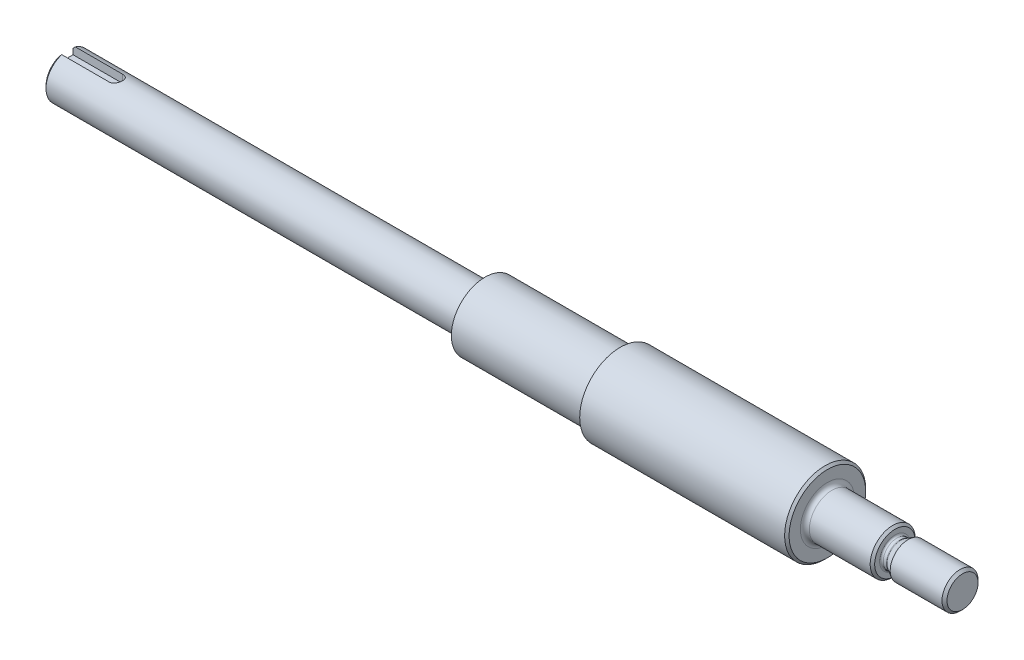
ISO-10303-21;
HEADER;
FILE_DESCRIPTION(('STEP AP214'),'2;1');
FILE_NAME('part.step','',(''),(''),'','','');
FILE_SCHEMA(('AUTOMOTIVE_DESIGN { 1 0 10303 214 1 1 1 1 }'));
ENDSEC;
DATA;
#1=APPLICATION_CONTEXT('core data for automotive mechanical design processes');
#2=APPLICATION_PROTOCOL_DEFINITION('international standard','automotive_design',2000,#1);
#3=PRODUCT_CONTEXT('',#1,'mechanical');
#4=PRODUCT('Part','Part','',(#3));
#5=PRODUCT_RELATED_PRODUCT_CATEGORY('part','',(#4));
#6=PRODUCT_DEFINITION_FORMATION('','',#4);
#7=PRODUCT_DEFINITION_CONTEXT('part definition',#1,'design');
#8=PRODUCT_DEFINITION('design','',#6,#7);
#9=PRODUCT_DEFINITION_SHAPE('','',#8);
#10=(LENGTH_UNIT() NAMED_UNIT(*) SI_UNIT(.MILLI.,.METRE.));
#11=(NAMED_UNIT(*) PLANE_ANGLE_UNIT() SI_UNIT($,.RADIAN.));
#12=(NAMED_UNIT(*) SI_UNIT($,.STERADIAN.) SOLID_ANGLE_UNIT());
#13=UNCERTAINTY_MEASURE_WITH_UNIT(LENGTH_MEASURE(1.E-05),#10,'distance_accuracy_value','');
#14=(GEOMETRIC_REPRESENTATION_CONTEXT(3) GLOBAL_UNCERTAINTY_ASSIGNED_CONTEXT((#13)) GLOBAL_UNIT_ASSIGNED_CONTEXT((#10,
#11,#12)) REPRESENTATION_CONTEXT('',''));
#15=CARTESIAN_POINT('',(0.,0.,0.));
#16=DIRECTION('',(0.,0.,1.));
#17=DIRECTION('',(1.,0.,0.));
#18=AXIS2_PLACEMENT_3D('',#15,#16,#17);
#19=CARTESIAN_POINT('',(0.,0.,0.));
#20=DIRECTION('',(-1.,0.,0.));
#21=DIRECTION('',(0.,0.,1.));
#22=AXIS2_PLACEMENT_3D('',#19,#20,#21);
#23=PLANE('',#22);
#24=DIRECTION('',(0.,1.,0.));
#25=VECTOR('',#24,1.);
#26=CARTESIAN_POINT('',(0.,0.,-1.5));
#27=LINE('',#26,#25);
#28=CARTESIAN_POINT('',(0.,3.,-1.5));
#29=VERTEX_POINT('',#28);
#30=CARTESIAN_POINT('',(0.,4.24264068711932,-1.5));
#31=VERTEX_POINT('',#30);
#32=EDGE_CURVE('E108',#29,#31,#27,.T.);
#33=ORIENTED_EDGE('',*,*,#32,.T.);
#34=CARTESIAN_POINT('',(0.,0.,0.));
#35=DIRECTION('',(-1.,0.,0.));
#36=DIRECTION('',(0.,0.,1.));
#37=AXIS2_PLACEMENT_3D('',#34,#35,#36);
#38=CIRCLE('',#37,4.50000000000003);
#39=CARTESIAN_POINT('',(0.,4.24264068711932,1.5));
#40=VERTEX_POINT('',#39);
#41=EDGE_CURVE('E270',#31,#40,#38,.T.);
#42=ORIENTED_EDGE('',*,*,#41,.T.);
#43=DIRECTION('',(0.,-1.,0.));
#44=VECTOR('',#43,1.);
#45=CARTESIAN_POINT('',(0.,0.,1.5));
#46=LINE('',#45,#44);
#47=CARTESIAN_POINT('',(0.,3.,1.5));
#48=VERTEX_POINT('',#47);
#49=EDGE_CURVE('E101',#40,#48,#46,.T.);
#50=ORIENTED_EDGE('',*,*,#49,.T.);
#51=DIRECTION('',(0.,0.,-1.));
#52=VECTOR('',#51,1.);
#53=CARTESIAN_POINT('',(0.,3.,0.));
#54=LINE('',#53,#52);
#55=EDGE_CURVE('E255',#48,#29,#54,.T.);
#56=ORIENTED_EDGE('',*,*,#55,.T.);
#57=EDGE_LOOP('',(#33,#42,#50,#56));
#58=FACE_BOUND('',#57,.T.);
#59=ADVANCED_FACE('F43',(#58),#23,.T.);
#60=CARTESIAN_POINT('',(0.,0.,0.));
#61=DIRECTION('',(-1.,0.,0.));
#62=DIRECTION('',(0.,0.,1.));
#63=AXIS2_PLACEMENT_3D('',#60,#61,#62);
#64=CYLINDRICAL_SURFACE('',#63,5.);
#65=CARTESIAN_POINT('',(92.,0.,0.));
#66=DIRECTION('',(-1.,0.,0.));
#67=DIRECTION('',(0.,0.,1.));
#68=AXIS2_PLACEMENT_3D('',#65,#66,#67);
#69=CIRCLE('',#68,5.);
#70=CARTESIAN_POINT('',(92.,0.,5.));
#71=VERTEX_POINT('',#70);
#72=EDGE_CURVE('E258',#71,#71,#69,.T.);
#73=ORIENTED_EDGE('',*,*,#72,.T.);
#74=EDGE_LOOP('',(#73));
#75=FACE_BOUND('',#74,.T.);
#76=DIRECTION('',(-1.,0.,0.));
#77=VECTOR('',#76,1.);
#78=CARTESIAN_POINT('',(0.,4.76969600708473,1.5));
#79=LINE('',#78,#77);
#80=CARTESIAN_POINT('',(11.,4.76969600708473,1.5));
#81=VERTEX_POINT('',#80);
#82=CARTESIAN_POINT('',(0.499999999999987,4.76969600708473,1.5));
#83=VERTEX_POINT('',#82);
#84=EDGE_CURVE('E134',#81,#83,#79,.T.);
#85=ORIENTED_EDGE('',*,*,#84,.T.);
#86=CARTESIAN_POINT('',(0.499999999999987,0.,0.));
#87=DIRECTION('',(-1.,0.,0.));
#88=DIRECTION('',(0.,0.,1.));
#89=AXIS2_PLACEMENT_3D('',#86,#87,#88);
#90=CIRCLE('',#89,5.);
#91=CARTESIAN_POINT('',(0.499999999999987,4.76969600708473,-1.5));
#92=VERTEX_POINT('',#91);
#93=EDGE_CURVE('E59',#83,#92,#90,.F.);
#94=ORIENTED_EDGE('',*,*,#93,.T.);
#95=DIRECTION('',(-1.,0.,0.));
#96=VECTOR('',#95,1.);
#97=CARTESIAN_POINT('',(0.,4.76969600708473,-1.5));
#98=LINE('',#97,#96);
#99=CARTESIAN_POINT('',(11.,4.76969600708473,-1.5));
#100=VERTEX_POINT('',#99);
#101=EDGE_CURVE('E143',#92,#100,#98,.F.);
#102=ORIENTED_EDGE('',*,*,#101,.T.);
#103=CARTESIAN_POINT('',(11.,4.76969600708473,-1.5));
#104=CARTESIAN_POINT('',(11.041179392908,4.76969249084934,-1.50000085357071));
#105=CARTESIAN_POINT('',(11.0823380431261,4.77022997000129,-1.49830317083428));
#106=CARTESIAN_POINT('',(11.1643411620956,4.77235095109999,-1.49153785660317));
#107=CARTESIAN_POINT('',(11.2051856993949,4.77393421787376,-1.48647098275841));
#108=CARTESIAN_POINT('',(11.3265905409547,4.78018490618873,-1.46630203689311));
#109=CARTESIAN_POINT('',(11.4063063904164,4.78635370384275,-1.44623120413662));
#110=CARTESIAN_POINT('',(11.5610355783859,4.80195952113208,-1.39353102315626));
#111=CARTESIAN_POINT('',(11.6360505521981,4.81139539670393,-1.36090607068203));
#112=CARTESIAN_POINT('',(11.7795966815976,4.83246571212052,-1.28407841117656));
#113=CARTESIAN_POINT('',(11.8481247997284,4.84410117434933,-1.23987031651226));
#114=CARTESIAN_POINT('',(11.978866055997,4.86866835244721,-1.13964850658326));
#115=CARTESIAN_POINT('',(12.0408436603434,4.88162755412974,-1.08333433465208));
#116=CARTESIAN_POINT('',(12.1546355839,4.90714811559049,-0.961138919873355));
#117=CARTESIAN_POINT('',(12.2064481860031,4.91970940785249,-0.895256063916349));
#118=CARTESIAN_POINT('',(12.2994637703185,4.94333239727705,-0.754109921315431));
#119=CARTESIAN_POINT('',(12.340425180298,4.95435770971354,-0.67868081933626));
#120=CARTESIAN_POINT('',(12.4089884116182,4.97334469846208,-0.521621185505775));
#121=CARTESIAN_POINT('',(12.4365936777943,4.98130716463903,-0.439992259012928));
#122=CARTESIAN_POINT('',(12.476879799102,4.99307639935002,-0.275324697874879));
#123=CARTESIAN_POINT('',(12.4899648579697,4.99699549276993,-0.192393125294255));
#124=CARTESIAN_POINT('',(12.5021173413633,5.00063202022426,-0.0254235719980832));
#125=CARTESIAN_POINT('',(12.5011874197002,5.00035024971471,0.0586141962423611));
#126=CARTESIAN_POINT('',(12.485607091241,4.99569602566267,0.222571599946016));
#127=CARTESIAN_POINT('',(12.4713946550213,4.99145415509187,0.30253714546464));
#128=CARTESIAN_POINT('',(12.4303683647619,4.9795151369998,0.458890052102024));
#129=CARTESIAN_POINT('',(12.4035538505441,4.97181780846028,0.535277225531996));
#130=CARTESIAN_POINT('',(12.3377877783536,4.95365214926145,0.683347815892215));
#131=CARTESIAN_POINT('',(12.2986983556431,4.94315255692525,0.754966006044141));
#132=CARTESIAN_POINT('',(12.2096014099517,4.92049624651755,0.890765529574419));
#133=CARTESIAN_POINT('',(12.1595914405212,4.90833915735884,0.954945191614594));
#134=CARTESIAN_POINT('',(12.0478080119165,4.88311673571409,1.07665450541275));
#135=CARTESIAN_POINT('',(11.9856561362393,4.87003445449554,1.13383351478034));
#136=CARTESIAN_POINT('',(11.8525025765721,4.84484215114658,1.23706769492487));
#137=CARTESIAN_POINT('',(11.7814983196345,4.83273241337565,1.28311962013078));
#138=CARTESIAN_POINT('',(11.6317190715507,4.81077228795653,1.36316407240863));
#139=CARTESIAN_POINT('',(11.5528728204066,4.80094596245948,1.39703006341135));
#140=CARTESIAN_POINT('',(11.3902754960183,4.78495663653201,1.45085886004699));
#141=CARTESIAN_POINT('',(11.3065321392856,4.77878803475875,1.47084293218035));
#142=CARTESIAN_POINT('',(11.1850051109298,4.77314032325006,1.4890120359008));
#143=CARTESIAN_POINT('',(11.1481092658204,4.77185156275267,1.49313202989009));
#144=CARTESIAN_POINT('',(11.0741485209005,4.77012928611782,1.49862355614854));
#145=CARTESIAN_POINT('',(11.0370839503361,4.76969451246644,1.49999912968269));
#146=CARTESIAN_POINT('',(11.,4.76969600708473,1.5));
#147=B_SPLINE_CURVE_WITH_KNOTS('',3,(#103,#104,#105,#106,#107,#108,#109,#110,#111,#112,#113,
#114,#115,#116,#117,#118,#119,#120,#121,#122,#123,#124,#125,#126,#127,#128,#129,#130,#131,#132,
#133,#134,#135,#136,#137,#138,#139,#140,#141,#142,#143,#144,#145,#146),.UNSPECIFIED.,.F.,.F.,(4,
2,2,2,2,2,2,2,2,2,2,2,2,2,2,2,2,2,2,2,2,4),(0.,0.123459071219734,0.246890388853042,
0.49291134961521,0.738846245884321,0.984895736828092,1.23795510798803,1.49105719006936,
1.74939356197455,2.00766326783256,2.25854751319802,2.5093842528947,2.75223130012966,
2.99509107067835,3.2407824256273,3.48652887757005,3.74172568310981,3.99699683536777,
4.25484698071527,4.51230123440207,4.62365084745809,4.73483637253615),.UNSPECIFIED.);
#148=EDGE_CURVE('E99',#100,#81,#147,.T.);
#149=ORIENTED_EDGE('',*,*,#148,.T.);
#150=EDGE_LOOP('',(#85,#94,#102,#149));
#151=FACE_BOUND('',#150,.T.);
#152=ADVANCED_FACE('F145',(#75,#151),#64,.T.);
#153=CARTESIAN_POINT('',(93.,0.,5.));
#154=DIRECTION('',(-1.,0.,0.));
#155=DIRECTION('',(0.,0.,1.));
#156=AXIS2_PLACEMENT_3D('',#153,#154,#155);
#157=PLANE('',#156);
#158=CARTESIAN_POINT('',(93.,0.,0.));
#159=DIRECTION('',(-1.,0.,0.));
#160=DIRECTION('',(0.,0.,1.));
#161=AXIS2_PLACEMENT_3D('',#158,#159,#160);
#162=CIRCLE('',#161,6.);
#163=CARTESIAN_POINT('',(93.,0.,6.));
#164=VERTEX_POINT('',#163);
#165=EDGE_CURVE('E263',#164,#164,#162,.F.);
#166=ORIENTED_EDGE('',*,*,#165,.T.);
#167=EDGE_LOOP('',(#166));
#168=FACE_BOUND('',#167,.T.);
#169=CARTESIAN_POINT('',(93.,0.,0.));
#170=DIRECTION('',(-1.,0.,0.));
#171=DIRECTION('',(0.,0.,1.));
#172=AXIS2_PLACEMENT_3D('',#169,#170,#171);
#173=CIRCLE('',#172,7.5);
#174=CARTESIAN_POINT('',(93.,0.,7.5));
#175=VERTEX_POINT('',#174);
#176=EDGE_CURVE('E131',#175,#175,#173,.T.);
#177=ORIENTED_EDGE('',*,*,#176,.T.);
#178=EDGE_LOOP('',(#177));
#179=FACE_BOUND('',#178,.T.);
#180=ADVANCED_FACE('F177',(#168,#179),#157,.T.);
#181=CARTESIAN_POINT('',(0.,0.,0.));
#182=DIRECTION('',(-1.,0.,0.));
#183=DIRECTION('',(0.,0.,1.));
#184=AXIS2_PLACEMENT_3D('',#181,#182,#183);
#185=CYLINDRICAL_SURFACE('',#184,7.5);
#186=CARTESIAN_POINT('',(122.,0.,0.));
#187=DIRECTION('',(-1.,0.,0.));
#188=DIRECTION('',(0.,0.,1.));
#189=AXIS2_PLACEMENT_3D('',#186,#187,#188);
#190=CIRCLE('',#189,7.5);
#191=CARTESIAN_POINT('',(122.,0.,7.5));
#192=VERTEX_POINT('',#191);
#193=EDGE_CURVE('E265',#192,#192,#190,.T.);
#194=ORIENTED_EDGE('',*,*,#193,.T.);
#195=EDGE_LOOP('',(#194));
#196=FACE_BOUND('',#195,.T.);
#197=ORIENTED_EDGE('',*,*,#176,.F.);
#198=EDGE_LOOP('',(#197));
#199=FACE_BOUND('',#198,.T.);
#200=ADVANCED_FACE('F174',(#196,#199),#185,.T.);
#201=CARTESIAN_POINT('',(123.,0.,7.5));
#202=DIRECTION('',(-1.,0.,0.));
#203=DIRECTION('',(0.,0.,1.));
#204=AXIS2_PLACEMENT_3D('',#201,#202,#203);
#205=PLANE('',#204);
#206=CARTESIAN_POINT('',(123.,0.,0.));
#207=DIRECTION('',(-1.,0.,0.));
#208=DIRECTION('',(0.,0.,1.));
#209=AXIS2_PLACEMENT_3D('',#206,#207,#208);
#210=CIRCLE('',#209,8.5);
#211=CARTESIAN_POINT('',(123.,0.,8.5));
#212=VERTEX_POINT('',#211);
#213=EDGE_CURVE('E268',#212,#212,#210,.F.);
#214=ORIENTED_EDGE('',*,*,#213,.T.);
#215=EDGE_LOOP('',(#214));
#216=FACE_BOUND('',#215,.T.);
#217=CARTESIAN_POINT('',(123.,0.,0.));
#218=DIRECTION('',(-1.,0.,0.));
#219=DIRECTION('',(0.,0.,1.));
#220=AXIS2_PLACEMENT_3D('',#217,#218,#219);
#221=CIRCLE('',#220,9.);
#222=CARTESIAN_POINT('',(123.,0.,9.));
#223=VERTEX_POINT('',#222);
#224=EDGE_CURVE('E128',#223,#223,#221,.T.);
#225=ORIENTED_EDGE('',*,*,#224,.T.);
#226=EDGE_LOOP('',(#225));
#227=FACE_BOUND('',#226,.T.);
#228=ADVANCED_FACE('F170',(#216,#227),#205,.T.);
#229=CARTESIAN_POINT('',(0.,0.,0.));
#230=DIRECTION('',(-1.,0.,0.));
#231=DIRECTION('',(0.,0.,1.));
#232=AXIS2_PLACEMENT_3D('',#229,#230,#231);
#233=CYLINDRICAL_SURFACE('',#232,9.);
#234=CARTESIAN_POINT('',(168.5,0.,0.));
#235=DIRECTION('',(1.,0.,0.));
#236=DIRECTION('',(0.,0.,-1.));
#237=AXIS2_PLACEMENT_3D('',#234,#235,#236);
#238=CIRCLE('',#237,9.);
#239=CARTESIAN_POINT('',(168.5,0.,-9.));
#240=VERTEX_POINT('',#239);
#241=EDGE_CURVE('E52',#240,#240,#238,.F.);
#242=ORIENTED_EDGE('',*,*,#241,.T.);
#243=EDGE_LOOP('',(#242));
#244=FACE_BOUND('',#243,.T.);
#245=ORIENTED_EDGE('',*,*,#224,.F.);
#246=EDGE_LOOP('',(#245));
#247=FACE_BOUND('',#246,.T.);
#248=ADVANCED_FACE('F166',(#244,#247),#233,.T.);
#249=CARTESIAN_POINT('',(169.,0.,9.));
#250=DIRECTION('',(1.,0.,0.));
#251=DIRECTION('',(0.,0.,-1.));
#252=AXIS2_PLACEMENT_3D('',#249,#250,#251);
#253=PLANE('',#252);
#254=CARTESIAN_POINT('',(169.,0.,0.));
#255=DIRECTION('',(1.,0.,0.));
#256=DIRECTION('',(0.,0.,-1.));
#257=AXIS2_PLACEMENT_3D('',#254,#255,#256);
#258=CIRCLE('',#257,8.49999999999994);
#259=CARTESIAN_POINT('',(169.,0.,-8.49999999999994));
#260=VERTEX_POINT('',#259);
#261=EDGE_CURVE('E11',#260,#260,#258,.T.);
#262=ORIENTED_EDGE('',*,*,#261,.T.);
#263=EDGE_LOOP('',(#262));
#264=FACE_BOUND('',#263,.T.);
#265=CARTESIAN_POINT('',(169.,0.,0.));
#266=DIRECTION('',(1.,0.,0.));
#267=DIRECTION('',(0.,0.,-1.));
#268=AXIS2_PLACEMENT_3D('',#265,#266,#267);
#269=CIRCLE('',#268,6.);
#270=CARTESIAN_POINT('',(169.,0.,-6.));
#271=VERTEX_POINT('',#270);
#272=EDGE_CURVE('E252',#271,#271,#269,.F.);
#273=ORIENTED_EDGE('',*,*,#272,.T.);
#274=EDGE_LOOP('',(#273));
#275=FACE_BOUND('',#274,.T.);
#276=ADVANCED_FACE('F162',(#264,#275),#253,.T.);
#277=CARTESIAN_POINT('',(0.,0.,0.));
#278=DIRECTION('',(-1.,0.,0.));
#279=DIRECTION('',(0.,0.,1.));
#280=AXIS2_PLACEMENT_3D('',#277,#278,#279);
#281=CYLINDRICAL_SURFACE('',#280,5.);
#282=CARTESIAN_POINT('',(183.5,0.,0.));
#283=DIRECTION('',(1.,0.,0.));
#284=DIRECTION('',(0.,0.,-1.));
#285=AXIS2_PLACEMENT_3D('',#282,#283,#284);
#286=CIRCLE('',#285,5.);
#287=CARTESIAN_POINT('',(183.5,0.,-5.));
#288=VERTEX_POINT('',#287);
#289=EDGE_CURVE('E228',#288,#288,#286,.F.);
#290=ORIENTED_EDGE('',*,*,#289,.T.);
#291=EDGE_LOOP('',(#290));
#292=FACE_BOUND('',#291,.T.);
#293=CARTESIAN_POINT('',(170.,0.,0.));
#294=DIRECTION('',(1.,0.,0.));
#295=DIRECTION('',(0.,0.,-1.));
#296=AXIS2_PLACEMENT_3D('',#293,#294,#295);
#297=CIRCLE('',#296,5.);
#298=CARTESIAN_POINT('',(170.,0.,-5.));
#299=VERTEX_POINT('',#298);
#300=EDGE_CURVE('E254',#299,#299,#297,.T.);
#301=ORIENTED_EDGE('',*,*,#300,.T.);
#302=EDGE_LOOP('',(#301));
#303=FACE_BOUND('',#302,.T.);
#304=ADVANCED_FACE('F158',(#292,#303),#281,.T.);
#305=CARTESIAN_POINT('',(184.,0.,5.));
#306=DIRECTION('',(1.,0.,0.));
#307=DIRECTION('',(0.,0.,-1.));
#308=AXIS2_PLACEMENT_3D('',#305,#306,#307);
#309=PLANE('',#308);
#310=CARTESIAN_POINT('',(184.,0.,0.));
#311=DIRECTION('',(1.,0.,0.));
#312=DIRECTION('',(0.,0.,-1.));
#313=AXIS2_PLACEMENT_3D('',#310,#311,#312);
#314=CIRCLE('',#313,4.49999999999998);
#315=CARTESIAN_POINT('',(184.,0.,-4.49999999999998));
#316=VERTEX_POINT('',#315);
#317=EDGE_CURVE('E231',#316,#316,#314,.T.);
#318=ORIENTED_EDGE('',*,*,#317,.T.);
#319=EDGE_LOOP('',(#318));
#320=FACE_BOUND('',#319,.T.);
#321=CARTESIAN_POINT('',(184.,0.,0.));
#322=DIRECTION('',(-1.,0.,0.));
#323=DIRECTION('',(0.,0.,1.));
#324=AXIS2_PLACEMENT_3D('',#321,#322,#323);
#325=CIRCLE('',#324,3.4);
#326=CARTESIAN_POINT('',(184.,0.,3.4));
#327=VERTEX_POINT('',#326);
#328=EDGE_CURVE('E314',#327,#327,#325,.T.);
#329=ORIENTED_EDGE('',*,*,#328,.T.);
#330=EDGE_LOOP('',(#329));
#331=FACE_BOUND('',#330,.T.);
#332=ADVANCED_FACE('F153',(#320,#331),#309,.T.);
#333=CARTESIAN_POINT('',(11.,13.,0.));
#334=DIRECTION('',(0.,-1.,0.));
#335=DIRECTION('',(0.,0.,-1.));
#336=AXIS2_PLACEMENT_3D('',#333,#334,#335);
#337=CYLINDRICAL_SURFACE('',#336,1.5);
#338=DIRECTION('',(0.,-1.,0.));
#339=VECTOR('',#338,1.);
#340=CARTESIAN_POINT('',(11.,13.,-1.5));
#341=LINE('',#340,#339);
#342=CARTESIAN_POINT('',(11.,3.,-1.5));
#343=VERTEX_POINT('',#342);
#344=EDGE_CURVE('E92',#100,#343,#341,.T.);
#345=ORIENTED_EDGE('',*,*,#344,.T.);
#346=CARTESIAN_POINT('',(11.,3.,0.));
#347=DIRECTION('',(0.,1.,0.));
#348=DIRECTION('',(0.,0.,1.));
#349=AXIS2_PLACEMENT_3D('',#346,#347,#348);
#350=CIRCLE('',#349,1.5);
#351=CARTESIAN_POINT('',(11.,3.,1.5));
#352=VERTEX_POINT('',#351);
#353=EDGE_CURVE('E97',#352,#343,#350,.T.);
#354=ORIENTED_EDGE('',*,*,#353,.F.);
#355=DIRECTION('',(0.,-1.,0.));
#356=VECTOR('',#355,1.);
#357=CARTESIAN_POINT('',(11.,13.,1.5));
#358=LINE('',#357,#356);
#359=EDGE_CURVE('E102',#81,#352,#358,.T.);
#360=ORIENTED_EDGE('',*,*,#359,.F.);
#361=ORIENTED_EDGE('',*,*,#148,.F.);
#362=EDGE_LOOP('',(#345,#354,#360,#361));
#363=FACE_BOUND('',#362,.T.);
#364=ADVANCED_FACE('F94',(#363),#337,.F.);
#365=CARTESIAN_POINT('',(-11.,13.,-1.5));
#366=DIRECTION('',(0.,0.,1.));
#367=DIRECTION('',(1.,0.,0.));
#368=AXIS2_PLACEMENT_3D('',#365,#366,#367);
#369=PLANE('',#368);
#370=ORIENTED_EDGE('',*,*,#101,.F.);
#371=CARTESIAN_POINT('',(0.499999999999987,4.76969600708473,-1.5));
#372=CARTESIAN_POINT('',(0.41641009364861,4.68209687485685,-1.5));
#373=CARTESIAN_POINT('',(0.332948478470118,4.5943760370242,-1.5));
#374=CARTESIAN_POINT('',(0.166281811745839,4.41869093042373,-1.5));
#375=CARTESIAN_POINT('',(0.0830767602576682,4.33072666160124,-1.5));
#376=CARTESIAN_POINT('',(0.,4.24264068711932,-1.5));
#377=B_SPLINE_CURVE_WITH_KNOTS('',3,(#371,#372,#373,#374,#375,#376),.UNSPECIFIED.,.F.,.F.,(4,2,
4),(0.,0.363245205590356,0.726490492749897),.UNSPECIFIED.);
#378=EDGE_CURVE('E222',#92,#31,#377,.T.);
#379=ORIENTED_EDGE('',*,*,#378,.T.);
#380=ORIENTED_EDGE('',*,*,#32,.F.);
#381=DIRECTION('',(-1.,0.,0.));
#382=VECTOR('',#381,1.);
#383=CARTESIAN_POINT('',(-11.,3.,-1.5));
#384=LINE('',#383,#382);
#385=EDGE_CURVE('E105',#343,#29,#384,.T.);
#386=ORIENTED_EDGE('',*,*,#385,.F.);
#387=ORIENTED_EDGE('',*,*,#344,.F.);
#388=EDGE_LOOP('',(#370,#379,#380,#386,#387));
#389=FACE_BOUND('',#388,.T.);
#390=ADVANCED_FACE('F106',(#389),#369,.T.);
#391=CARTESIAN_POINT('',(-11.,13.,1.5));
#392=DIRECTION('',(0.,0.,-1.));
#393=DIRECTION('',(-1.,0.,0.));
#394=AXIS2_PLACEMENT_3D('',#391,#392,#393);
#395=PLANE('',#394);
#396=ORIENTED_EDGE('',*,*,#49,.F.);
#397=CARTESIAN_POINT('',(0.,4.24264068711932,1.5));
#398=CARTESIAN_POINT('',(0.0830767602576683,4.33072666160124,1.5));
#399=CARTESIAN_POINT('',(0.166281811745839,4.41869093042373,1.5));
#400=CARTESIAN_POINT('',(0.332948478470118,4.5943760370242,1.5));
#401=CARTESIAN_POINT('',(0.41641009364861,4.68209687485685,1.5));
#402=CARTESIAN_POINT('',(0.499999999999987,4.76969600708473,1.5));
#403=B_SPLINE_CURVE_WITH_KNOTS('',3,(#397,#398,#399,#400,#401,#402),.UNSPECIFIED.,.F.,.F.,(4,2,
4),(0.,0.363245287159541,0.726490492749897),.UNSPECIFIED.);
#404=EDGE_CURVE('E67',#40,#83,#403,.T.);
#405=ORIENTED_EDGE('',*,*,#404,.T.);
#406=ORIENTED_EDGE('',*,*,#84,.F.);
#407=ORIENTED_EDGE('',*,*,#359,.T.);
#408=DIRECTION('',(1.,0.,0.));
#409=VECTOR('',#408,1.);
#410=CARTESIAN_POINT('',(-11.,3.,1.5));
#411=LINE('',#410,#409);
#412=EDGE_CURVE('E112',#48,#352,#411,.T.);
#413=ORIENTED_EDGE('',*,*,#412,.F.);
#414=EDGE_LOOP('',(#396,#405,#406,#407,#413));
#415=FACE_BOUND('',#414,.T.);
#416=ADVANCED_FACE('F274',(#415),#395,.T.);
#417=CARTESIAN_POINT('',(11.,3.,0.));
#418=DIRECTION('',(0.,1.,0.));
#419=DIRECTION('',(0.,0.,1.));
#420=AXIS2_PLACEMENT_3D('',#417,#418,#419);
#421=PLANE('',#420);
#422=ORIENTED_EDGE('',*,*,#412,.T.);
#423=ORIENTED_EDGE('',*,*,#353,.T.);
#424=ORIENTED_EDGE('',*,*,#385,.T.);
#425=ORIENTED_EDGE('',*,*,#55,.F.);
#426=EDGE_LOOP('',(#422,#423,#424,#425));
#427=FACE_BOUND('',#426,.T.);
#428=ADVANCED_FACE('F115',(#427),#421,.T.);
#429=CARTESIAN_POINT('',(170.,0.,0.));
#430=DIRECTION('',(1.,0.,0.));
#431=DIRECTION('',(0.,0.,-1.));
#432=AXIS2_PLACEMENT_3D('',#429,#430,#431);
#433=TOROIDAL_SURFACE('',#432,6.,1.);
#434=ORIENTED_EDGE('',*,*,#300,.F.);
#435=EDGE_LOOP('',(#434));
#436=FACE_BOUND('',#435,.T.);
#437=ORIENTED_EDGE('',*,*,#272,.F.);
#438=EDGE_LOOP('',(#437));
#439=FACE_BOUND('',#438,.T.);
#440=ADVANCED_FACE('F192',(#436,#439),#433,.F.);
#441=CARTESIAN_POINT('',(92.,0.,0.));
#442=DIRECTION('',(-1.,0.,0.));
#443=DIRECTION('',(0.,0.,1.));
#444=AXIS2_PLACEMENT_3D('',#441,#442,#443);
#445=TOROIDAL_SURFACE('',#444,6.,1.);
#446=ORIENTED_EDGE('',*,*,#165,.F.);
#447=EDGE_LOOP('',(#446));
#448=FACE_BOUND('',#447,.T.);
#449=ORIENTED_EDGE('',*,*,#72,.F.);
#450=EDGE_LOOP('',(#449));
#451=FACE_BOUND('',#450,.T.);
#452=ADVANCED_FACE('F195',(#448,#451),#445,.F.);
#453=CARTESIAN_POINT('',(122.,0.,0.));
#454=DIRECTION('',(-1.,0.,0.));
#455=DIRECTION('',(0.,0.,1.));
#456=AXIS2_PLACEMENT_3D('',#453,#454,#455);
#457=TOROIDAL_SURFACE('',#456,8.5,1.);
#458=ORIENTED_EDGE('',*,*,#213,.F.);
#459=EDGE_LOOP('',(#458));
#460=FACE_BOUND('',#459,.T.);
#461=ORIENTED_EDGE('',*,*,#193,.F.);
#462=EDGE_LOOP('',(#461));
#463=FACE_BOUND('',#462,.T.);
#464=ADVANCED_FACE('F199',(#460,#463),#457,.F.);
#465=CARTESIAN_POINT('',(0.,0.,0.));
#466=DIRECTION('',(1.,0.,0.));
#467=DIRECTION('',(0.,0.,-1.));
#468=AXIS2_PLACEMENT_3D('',#465,#466,#467);
#469=CONICAL_SURFACE('',#468,4.50000000000003,0.785398163397431);
#470=ORIENTED_EDGE('',*,*,#378,.F.);
#471=ORIENTED_EDGE('',*,*,#93,.F.);
#472=ORIENTED_EDGE('',*,*,#404,.F.);
#473=ORIENTED_EDGE('',*,*,#41,.F.);
#474=EDGE_LOOP('',(#470,#471,#472,#473));
#475=FACE_BOUND('',#474,.T.);
#476=ADVANCED_FACE('F203',(#475),#469,.T.);
#477=CARTESIAN_POINT('',(183.5,0.,0.));
#478=DIRECTION('',(-1.,0.,0.));
#479=DIRECTION('',(0.,0.,1.));
#480=AXIS2_PLACEMENT_3D('',#477,#478,#479);
#481=CONICAL_SURFACE('',#480,5.,0.785398163397472);
#482=ORIENTED_EDGE('',*,*,#317,.F.);
#483=EDGE_LOOP('',(#482));
#484=FACE_BOUND('',#483,.T.);
#485=ORIENTED_EDGE('',*,*,#289,.F.);
#486=EDGE_LOOP('',(#485));
#487=FACE_BOUND('',#486,.T.);
#488=ADVANCED_FACE('F211',(#484,#487),#481,.T.);
#489=CARTESIAN_POINT('',(168.5,0.,0.));
#490=DIRECTION('',(-1.,0.,0.));
#491=DIRECTION('',(0.,0.,1.));
#492=AXIS2_PLACEMENT_3D('',#489,#490,#491);
#493=CONICAL_SURFACE('',#492,9.,0.785398163397481);
#494=ORIENTED_EDGE('',*,*,#261,.F.);
#495=EDGE_LOOP('',(#494));
#496=FACE_BOUND('',#495,.T.);
#497=ORIENTED_EDGE('',*,*,#241,.F.);
#498=EDGE_LOOP('',(#497));
#499=FACE_BOUND('',#498,.T.);
#500=ADVANCED_FACE('F46',(#496,#499),#493,.T.);
#501=CARTESIAN_POINT('',(199.,0.,0.));
#502=DIRECTION('',(-1.,0.,0.));
#503=DIRECTION('',(0.,0.,1.));
#504=AXIS2_PLACEMENT_3D('',#501,#502,#503);
#505=CYLINDRICAL_SURFACE('',#504,4.);
#506=CARTESIAN_POINT('',(186.939230484541,0.,0.));
#507=DIRECTION('',(-1.,0.,0.));
#508=DIRECTION('',(0.,0.,1.));
#509=AXIS2_PLACEMENT_3D('',#506,#507,#508);
#510=CIRCLE('',#509,4.);
#511=CARTESIAN_POINT('',(186.939230484541,0.,4.));
#512=VERTEX_POINT('',#511);
#513=EDGE_CURVE('E117',#512,#512,#510,.T.);
#514=ORIENTED_EDGE('',*,*,#513,.F.);
#515=EDGE_LOOP('',(#514));
#516=FACE_BOUND('',#515,.T.);
#517=CARTESIAN_POINT('',(198.4455,0.,0.));
#518=DIRECTION('',(-1.,0.,0.));
#519=DIRECTION('',(0.,0.,1.));
#520=AXIS2_PLACEMENT_3D('',#517,#518,#519);
#521=CIRCLE('',#520,4.);
#522=CARTESIAN_POINT('',(198.4455,0.,4.));
#523=VERTEX_POINT('',#522);
#524=EDGE_CURVE('E310',#523,#523,#521,.T.);
#525=ORIENTED_EDGE('',*,*,#524,.T.);
#526=EDGE_LOOP('',(#525));
#527=FACE_BOUND('',#526,.T.);
#528=ADVANCED_FACE('F238',(#516,#527),#505,.T.);
#529=CARTESIAN_POINT('',(186.939230484541,0.,0.));
#530=DIRECTION('',(1.,0.,0.));
#531=DIRECTION('',(0.,0.,-1.));
#532=AXIS2_PLACEMENT_3D('',#529,#530,#531);
#533=CONICAL_SURFACE('',#532,4.,0.523598775598303);
#534=CARTESIAN_POINT('',(185.3,0.,0.));
#535=DIRECTION('',(-1.,0.,0.));
#536=DIRECTION('',(0.,0.,1.));
#537=AXIS2_PLACEMENT_3D('',#534,#535,#536);
#538=CIRCLE('',#537,3.05358983848622);
#539=CARTESIAN_POINT('',(185.3,0.,3.05358983848622));
#540=VERTEX_POINT('',#539);
#541=EDGE_CURVE('E120',#540,#540,#538,.T.);
#542=ORIENTED_EDGE('',*,*,#541,.F.);
#543=EDGE_LOOP('',(#542));
#544=FACE_BOUND('',#543,.T.);
#545=ORIENTED_EDGE('',*,*,#513,.T.);
#546=EDGE_LOOP('',(#545));
#547=FACE_BOUND('',#546,.T.);
#548=ADVANCED_FACE('F244',(#544,#547),#533,.T.);
#549=CARTESIAN_POINT('',(185.1,0.,0.));
#550=DIRECTION('',(-1.,0.,0.));
#551=DIRECTION('',(0.,0.,1.));
#552=AXIS2_PLACEMENT_3D('',#549,#550,#551);
#553=TOROIDAL_SURFACE('',#552,3.4,0.400000000000001);
#554=CARTESIAN_POINT('',(185.1,0.,0.));
#555=DIRECTION('',(-1.,0.,0.));
#556=DIRECTION('',(0.,0.,1.));
#557=AXIS2_PLACEMENT_3D('',#554,#555,#556);
#558=CIRCLE('',#557,3.);
#559=CARTESIAN_POINT('',(185.1,0.,3.));
#560=VERTEX_POINT('',#559);
#561=EDGE_CURVE('E323',#560,#560,#558,.T.);
#562=ORIENTED_EDGE('',*,*,#561,.F.);
#563=EDGE_LOOP('',(#562));
#564=FACE_BOUND('',#563,.T.);
#565=ORIENTED_EDGE('',*,*,#541,.T.);
#566=EDGE_LOOP('',(#565));
#567=FACE_BOUND('',#566,.T.);
#568=ADVANCED_FACE('F290',(#564,#567),#553,.F.);
#569=CARTESIAN_POINT('',(199.,0.,0.));
#570=DIRECTION('',(-1.,0.,0.));
#571=DIRECTION('',(0.,0.,1.));
#572=AXIS2_PLACEMENT_3D('',#569,#570,#571);
#573=CYLINDRICAL_SURFACE('',#572,3.);
#574=CARTESIAN_POINT('',(184.4,0.,0.));
#575=DIRECTION('',(-1.,0.,0.));
#576=DIRECTION('',(0.,0.,1.));
#577=AXIS2_PLACEMENT_3D('',#574,#575,#576);
#578=CIRCLE('',#577,3.);
#579=CARTESIAN_POINT('',(184.4,0.,3.));
#580=VERTEX_POINT('',#579);
#581=EDGE_CURVE('E317',#580,#580,#578,.T.);
#582=ORIENTED_EDGE('',*,*,#581,.F.);
#583=EDGE_LOOP('',(#582));
#584=FACE_BOUND('',#583,.T.);
#585=ORIENTED_EDGE('',*,*,#561,.T.);
#586=EDGE_LOOP('',(#585));
#587=FACE_BOUND('',#586,.T.);
#588=ADVANCED_FACE('F294',(#584,#587),#573,.T.);
#589=CARTESIAN_POINT('',(184.4,0.,0.));
#590=DIRECTION('',(-1.,0.,0.));
#591=DIRECTION('',(0.,0.,1.));
#592=AXIS2_PLACEMENT_3D('',#589,#590,#591);
#593=TOROIDAL_SURFACE('',#592,3.4,0.399999999999999);
#594=ORIENTED_EDGE('',*,*,#328,.F.);
#595=EDGE_LOOP('',(#594));
#596=FACE_BOUND('',#595,.T.);
#597=ORIENTED_EDGE('',*,*,#581,.T.);
#598=EDGE_LOOP('',(#597));
#599=FACE_BOUND('',#598,.T.);
#600=ADVANCED_FACE('F298',(#596,#599),#593,.F.);
#601=CARTESIAN_POINT('',(199.,0.,0.));
#602=DIRECTION('',(-1.,0.,0.));
#603=DIRECTION('',(0.,0.,1.));
#604=AXIS2_PLACEMENT_3D('',#601,#602,#603);
#605=CONICAL_SURFACE('',#604,3.4455,0.785398163397461);
#606=ORIENTED_EDGE('',*,*,#524,.F.);
#607=EDGE_LOOP('',(#606));
#608=FACE_BOUND('',#607,.T.);
#609=CARTESIAN_POINT('',(199.,0.,0.));
#610=DIRECTION('',(-1.,0.,0.));
#611=DIRECTION('',(0.,0.,1.));
#612=AXIS2_PLACEMENT_3D('',#609,#610,#611);
#613=CIRCLE('',#612,3.4455);
#614=CARTESIAN_POINT('',(199.,0.,3.4455));
#615=VERTEX_POINT('',#614);
#616=EDGE_CURVE('E313',#615,#615,#613,.T.);
#617=ORIENTED_EDGE('',*,*,#616,.T.);
#618=EDGE_LOOP('',(#617));
#619=FACE_BOUND('',#618,.T.);
#620=ADVANCED_FACE('F285',(#608,#619),#605,.T.);
#621=CARTESIAN_POINT('',(199.,0.,0.));
#622=DIRECTION('',(1.,0.,0.));
#623=DIRECTION('',(0.,0.,-1.));
#624=AXIS2_PLACEMENT_3D('',#621,#622,#623);
#625=PLANE('',#624);
#626=ORIENTED_EDGE('',*,*,#616,.F.);
#627=EDGE_LOOP('',(#626));
#628=FACE_BOUND('',#627,.T.);
#629=ADVANCED_FACE('F283',(#628),#625,.T.);
#630=CLOSED_SHELL('',(#59,#152,#180,#200,#228,#248,#276,#304,#332,#364,#390,#416,#428,#440,#452,
#464,#476,#488,#500,#528,#548,#568,#588,#600,#620,#629));
#631=MANIFOLD_SOLID_BREP('B2',#630);
#632=ADVANCED_BREP_SHAPE_REPRESENTATION('',(#18,#631),#14);
#633=SHAPE_DEFINITION_REPRESENTATION(#9,#632);
ENDSEC;
END-ISO-10303-21;
